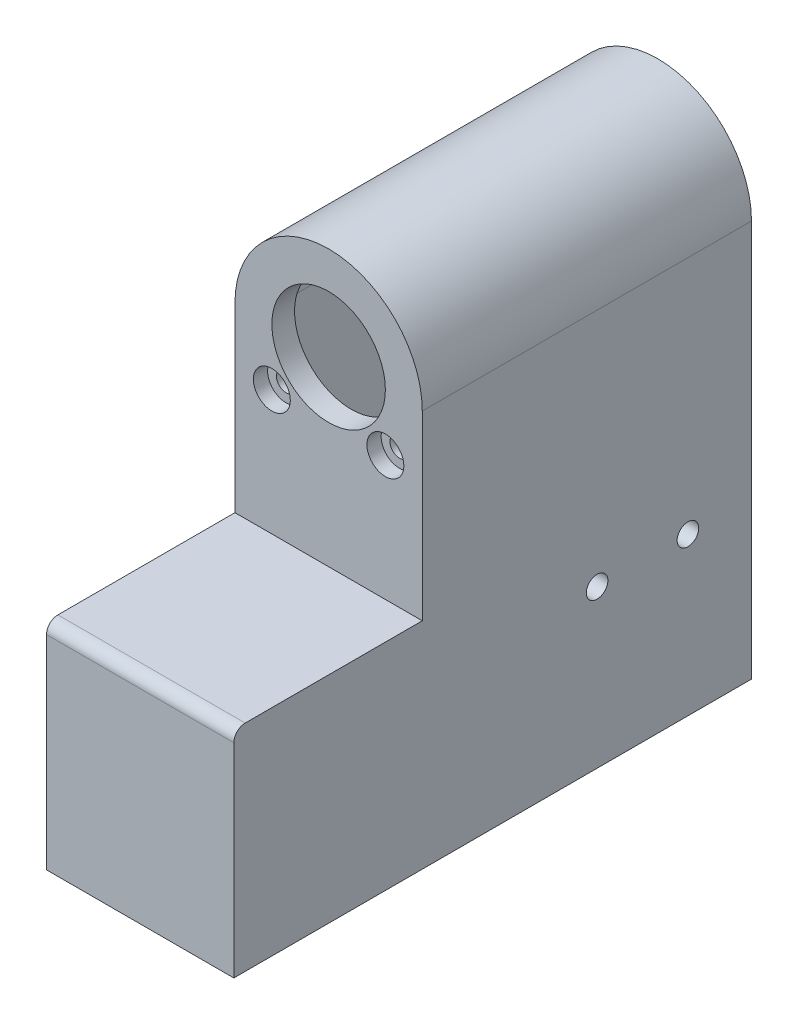
ISO-10303-21;
HEADER;
FILE_DESCRIPTION(('STEP AP214'),'2;1');
FILE_NAME('part.step','',(''),(''),'','','');
FILE_SCHEMA(('AUTOMOTIVE_DESIGN { 1 0 10303 214 1 1 1 1 }'));
ENDSEC;
DATA;
#1=APPLICATION_CONTEXT('core data for automotive mechanical design processes');
#2=APPLICATION_PROTOCOL_DEFINITION('international standard','automotive_design',2000,#1);
#3=PRODUCT_CONTEXT('',#1,'mechanical');
#4=PRODUCT('Part','Part','',(#3));
#5=PRODUCT_RELATED_PRODUCT_CATEGORY('part','',(#4));
#6=PRODUCT_DEFINITION_FORMATION('','',#4);
#7=PRODUCT_DEFINITION_CONTEXT('part definition',#1,'design');
#8=PRODUCT_DEFINITION('design','',#6,#7);
#9=PRODUCT_DEFINITION_SHAPE('','',#8);
#10=(LENGTH_UNIT() NAMED_UNIT(*) SI_UNIT(.MILLI.,.METRE.));
#11=(NAMED_UNIT(*) PLANE_ANGLE_UNIT() SI_UNIT($,.RADIAN.));
#12=(NAMED_UNIT(*) SI_UNIT($,.STERADIAN.) SOLID_ANGLE_UNIT());
#13=UNCERTAINTY_MEASURE_WITH_UNIT(LENGTH_MEASURE(1.E-05),#10,'distance_accuracy_value','');
#14=(GEOMETRIC_REPRESENTATION_CONTEXT(3) GLOBAL_UNCERTAINTY_ASSIGNED_CONTEXT((#13)) GLOBAL_UNIT_ASSIGNED_CONTEXT((#10,
#11,#12)) REPRESENTATION_CONTEXT('',''));
#15=CARTESIAN_POINT('',(0.,0.,0.));
#16=DIRECTION('',(0.,0.,1.));
#17=DIRECTION('',(1.,0.,0.));
#18=AXIS2_PLACEMENT_3D('',#15,#16,#17);
#19=CARTESIAN_POINT('',(33.,0.,71.));
#20=DIRECTION('',(-1.,0.,0.));
#21=DIRECTION('',(0.,0.,1.));
#22=AXIS2_PLACEMENT_3D('',#19,#20,#21);
#23=PLANE('',#22);
#24=CARTESIAN_POINT('',(33.,38.3,40.2));
#25=DIRECTION('',(-1.,0.,0.));
#26=DIRECTION('',(0.,0.,1.));
#27=AXIS2_PLACEMENT_3D('',#24,#25,#26);
#28=CIRCLE('',#27,1.9);
#29=CARTESIAN_POINT('',(33.,38.3,42.1));
#30=VERTEX_POINT('',#29);
#31=EDGE_CURVE('E256',#30,#30,#28,.F.);
#32=ORIENTED_EDGE('',*,*,#31,.F.);
#33=EDGE_LOOP('',(#32));
#34=FACE_BOUND('',#33,.T.);
#35=CARTESIAN_POINT('',(33.,38.3,24.2));
#36=DIRECTION('',(-1.,0.,0.));
#37=DIRECTION('',(0.,0.,1.));
#38=AXIS2_PLACEMENT_3D('',#35,#36,#37);
#39=CIRCLE('',#38,1.9);
#40=CARTESIAN_POINT('',(33.,38.3,26.1));
#41=VERTEX_POINT('',#40);
#42=EDGE_CURVE('E260',#41,#41,#39,.F.);
#43=ORIENTED_EDGE('',*,*,#42,.F.);
#44=EDGE_LOOP('',(#43));
#45=FACE_BOUND('',#44,.T.);
#46=DIRECTION('',(0.,0.,-1.));
#47=VECTOR('',#46,1.);
#48=CARTESIAN_POINT('',(33.,48.5,101.2));
#49=LINE('',#48,#47);
#50=CARTESIAN_POINT('',(33.,48.5,102.2));
#51=VERTEX_POINT('',#50);
#52=CARTESIAN_POINT('',(33.,48.5,71.));
#53=VERTEX_POINT('',#52);
#54=EDGE_CURVE('E192',#51,#53,#49,.T.);
#55=ORIENTED_EDGE('',*,*,#54,.F.);
#56=CARTESIAN_POINT('',(33.,46.5,102.2));
#57=DIRECTION('',(-1.,0.,0.));
#58=DIRECTION('',(0.,0.,1.));
#59=AXIS2_PLACEMENT_3D('',#56,#57,#58);
#60=CIRCLE('',#59,2.);
#61=CARTESIAN_POINT('',(33.,46.5,104.2));
#62=VERTEX_POINT('',#61);
#63=EDGE_CURVE('E11',#51,#62,#60,.F.);
#64=ORIENTED_EDGE('',*,*,#63,.T.);
#65=DIRECTION('',(0.,1.,0.));
#66=VECTOR('',#65,1.);
#67=CARTESIAN_POINT('',(33.,10.6,104.2));
#68=LINE('',#67,#66);
#69=CARTESIAN_POINT('',(33.,10.6,104.2));
#70=VERTEX_POINT('',#69);
#71=EDGE_CURVE('E132',#70,#62,#68,.T.);
#72=ORIENTED_EDGE('',*,*,#71,.F.);
#73=DIRECTION('',(0.,0.,1.));
#74=VECTOR('',#73,1.);
#75=CARTESIAN_POINT('',(33.,10.6,13.));
#76=LINE('',#75,#74);
#77=CARTESIAN_POINT('',(33.,10.6,13.));
#78=VERTEX_POINT('',#77);
#79=EDGE_CURVE('E142',#78,#70,#76,.T.);
#80=ORIENTED_EDGE('',*,*,#79,.F.);
#81=DIRECTION('',(0.,-1.,0.));
#82=VECTOR('',#81,1.);
#83=CARTESIAN_POINT('',(33.,80.5,13.));
#84=LINE('',#83,#82);
#85=CARTESIAN_POINT('',(33.,80.5,13.));
#86=VERTEX_POINT('',#85);
#87=EDGE_CURVE('E184',#86,#78,#84,.T.);
#88=ORIENTED_EDGE('',*,*,#87,.F.);
#89=DIRECTION('',(0.,0.,-1.));
#90=VECTOR('',#89,1.);
#91=CARTESIAN_POINT('',(33.,80.5,71.));
#92=LINE('',#91,#90);
#93=CARTESIAN_POINT('',(33.,80.5,71.));
#94=VERTEX_POINT('',#93);
#95=EDGE_CURVE('E220',#94,#86,#92,.T.);
#96=ORIENTED_EDGE('',*,*,#95,.F.);
#97=DIRECTION('',(0.,1.,0.));
#98=VECTOR('',#97,1.);
#99=CARTESIAN_POINT('',(33.,0.,71.));
#100=LINE('',#99,#98);
#101=EDGE_CURVE('E210',#53,#94,#100,.T.);
#102=ORIENTED_EDGE('',*,*,#101,.F.);
#103=EDGE_LOOP('',(#55,#64,#72,#80,#88,#96,#102));
#104=FACE_BOUND('',#103,.T.);
#105=ADVANCED_FACE('F35',(#34,#45,#104),#23,.F.);
#106=CARTESIAN_POINT('',(0.,0.,71.));
#107=DIRECTION('',(-1.,0.,0.));
#108=DIRECTION('',(0.,0.,1.));
#109=AXIS2_PLACEMENT_3D('',#106,#107,#108);
#110=PLANE('',#109);
#111=CARTESIAN_POINT('',(0.,38.3,24.2));
#112=DIRECTION('',(-1.,0.,0.));
#113=DIRECTION('',(0.,0.,1.));
#114=AXIS2_PLACEMENT_3D('',#111,#112,#113);
#115=CIRCLE('',#114,1.9);
#116=CARTESIAN_POINT('',(0.,38.3,26.1));
#117=VERTEX_POINT('',#116);
#118=EDGE_CURVE('E257',#117,#117,#115,.T.);
#119=ORIENTED_EDGE('',*,*,#118,.F.);
#120=EDGE_LOOP('',(#119));
#121=FACE_BOUND('',#120,.T.);
#122=CARTESIAN_POINT('',(0.,38.3,40.2));
#123=DIRECTION('',(-1.,0.,0.));
#124=DIRECTION('',(0.,0.,1.));
#125=AXIS2_PLACEMENT_3D('',#122,#123,#124);
#126=CIRCLE('',#125,1.9);
#127=CARTESIAN_POINT('',(0.,38.3,42.1));
#128=VERTEX_POINT('',#127);
#129=EDGE_CURVE('E261',#128,#128,#126,.T.);
#130=ORIENTED_EDGE('',*,*,#129,.F.);
#131=EDGE_LOOP('',(#130));
#132=FACE_BOUND('',#131,.T.);
#133=DIRECTION('',(0.,-1.,0.));
#134=VECTOR('',#133,1.);
#135=CARTESIAN_POINT('',(0.,48.5,104.2));
#136=LINE('',#135,#134);
#137=CARTESIAN_POINT('',(0.,46.5,104.2));
#138=VERTEX_POINT('',#137);
#139=CARTESIAN_POINT('',(0.,10.6,104.2));
#140=VERTEX_POINT('',#139);
#141=EDGE_CURVE('E134',#138,#140,#136,.T.);
#142=ORIENTED_EDGE('',*,*,#141,.F.);
#143=CARTESIAN_POINT('',(0.,46.5,102.2));
#144=DIRECTION('',(-1.,0.,0.));
#145=DIRECTION('',(0.,0.,1.));
#146=AXIS2_PLACEMENT_3D('',#143,#144,#145);
#147=CIRCLE('',#146,2.);
#148=CARTESIAN_POINT('',(0.,48.5,102.2));
#149=VERTEX_POINT('',#148);
#150=EDGE_CURVE('E57',#138,#149,#147,.T.);
#151=ORIENTED_EDGE('',*,*,#150,.T.);
#152=DIRECTION('',(0.,0.,-1.));
#153=VECTOR('',#152,1.);
#154=CARTESIAN_POINT('',(0.,48.5,101.2));
#155=LINE('',#154,#153);
#156=CARTESIAN_POINT('',(0.,48.5,71.));
#157=VERTEX_POINT('',#156);
#158=EDGE_CURVE('E195',#149,#157,#155,.T.);
#159=ORIENTED_EDGE('',*,*,#158,.T.);
#160=DIRECTION('',(0.,1.,0.));
#161=VECTOR('',#160,1.);
#162=CARTESIAN_POINT('',(0.,0.,71.));
#163=LINE('',#162,#161);
#164=CARTESIAN_POINT('',(0.,80.5,71.));
#165=VERTEX_POINT('',#164);
#166=EDGE_CURVE('E215',#157,#165,#163,.T.);
#167=ORIENTED_EDGE('',*,*,#166,.T.);
#168=DIRECTION('',(0.,0.,-1.));
#169=VECTOR('',#168,1.);
#170=CARTESIAN_POINT('',(0.,80.5,71.));
#171=LINE('',#170,#169);
#172=CARTESIAN_POINT('',(0.,80.5,13.));
#173=VERTEX_POINT('',#172);
#174=EDGE_CURVE('E217',#165,#173,#171,.T.);
#175=ORIENTED_EDGE('',*,*,#174,.T.);
#176=DIRECTION('',(0.,1.,0.));
#177=VECTOR('',#176,1.);
#178=CARTESIAN_POINT('',(0.,0.,13.));
#179=LINE('',#178,#177);
#180=CARTESIAN_POINT('',(0.,10.6,13.));
#181=VERTEX_POINT('',#180);
#182=EDGE_CURVE('E180',#181,#173,#179,.T.);
#183=ORIENTED_EDGE('',*,*,#182,.F.);
#184=DIRECTION('',(0.,0.,-1.));
#185=VECTOR('',#184,1.);
#186=CARTESIAN_POINT('',(0.,10.6,105.2));
#187=LINE('',#186,#185);
#188=EDGE_CURVE('E150',#140,#181,#187,.T.);
#189=ORIENTED_EDGE('',*,*,#188,.F.);
#190=EDGE_LOOP('',(#142,#151,#159,#167,#175,#183,#189));
#191=FACE_BOUND('',#190,.T.);
#192=ADVANCED_FACE('F244',(#121,#132,#191),#110,.T.);
#193=CARTESIAN_POINT('',(0.,48.5,101.2));
#194=DIRECTION('',(0.,-1.,0.));
#195=DIRECTION('',(0.,0.,-1.));
#196=AXIS2_PLACEMENT_3D('',#193,#194,#195);
#197=PLANE('',#196);
#198=ORIENTED_EDGE('',*,*,#158,.F.);
#199=DIRECTION('',(-1.,0.,0.));
#200=VECTOR('',#199,1.);
#201=CARTESIAN_POINT('',(33.,48.5,102.2));
#202=LINE('',#201,#200);
#203=EDGE_CURVE('E43',#149,#51,#202,.F.);
#204=ORIENTED_EDGE('',*,*,#203,.T.);
#205=ORIENTED_EDGE('',*,*,#54,.T.);
#206=DIRECTION('',(1.,0.,0.));
#207=VECTOR('',#206,1.);
#208=CARTESIAN_POINT('',(33.,48.5,71.));
#209=LINE('',#208,#207);
#210=EDGE_CURVE('E194',#157,#53,#209,.T.);
#211=ORIENTED_EDGE('',*,*,#210,.F.);
#212=EDGE_LOOP('',(#198,#204,#205,#211));
#213=FACE_BOUND('',#212,.T.);
#214=ADVANCED_FACE('F322',(#213),#197,.F.);
#215=CARTESIAN_POINT('',(0.,10.6,0.));
#216=DIRECTION('',(0.,-1.,0.));
#217=DIRECTION('',(0.,0.,-1.));
#218=AXIS2_PLACEMENT_3D('',#215,#216,#217);
#219=PLANE('',#218);
#220=ORIENTED_EDGE('',*,*,#79,.T.);
#221=DIRECTION('',(1.,0.,0.));
#222=VECTOR('',#221,1.);
#223=CARTESIAN_POINT('',(0.,10.6,104.2));
#224=LINE('',#223,#222);
#225=EDGE_CURVE('E128',#140,#70,#224,.T.);
#226=ORIENTED_EDGE('',*,*,#225,.F.);
#227=ORIENTED_EDGE('',*,*,#188,.T.);
#228=DIRECTION('',(1.,0.,0.));
#229=VECTOR('',#228,1.);
#230=CARTESIAN_POINT('',(0.,10.6,13.));
#231=LINE('',#230,#229);
#232=CARTESIAN_POINT('',(4.,10.6,13.));
#233=VERTEX_POINT('',#232);
#234=EDGE_CURVE('E280',#181,#233,#231,.T.);
#235=ORIENTED_EDGE('',*,*,#234,.T.);
#236=DIRECTION('',(0.,0.,1.));
#237=VECTOR('',#236,1.);
#238=CARTESIAN_POINT('',(4.,10.6,13.));
#239=LINE('',#238,#237);
#240=CARTESIAN_POINT('',(4.,10.6,100.2));
#241=VERTEX_POINT('',#240);
#242=EDGE_CURVE('E282',#233,#241,#239,.T.);
#243=ORIENTED_EDGE('',*,*,#242,.T.);
#244=DIRECTION('',(-1.,0.,0.));
#245=VECTOR('',#244,1.);
#246=CARTESIAN_POINT('',(29.,10.6,100.2));
#247=LINE('',#246,#245);
#248=CARTESIAN_POINT('',(29.,10.6,100.2));
#249=VERTEX_POINT('',#248);
#250=EDGE_CURVE('E250',#249,#241,#247,.T.);
#251=ORIENTED_EDGE('',*,*,#250,.F.);
#252=DIRECTION('',(0.,0.,-1.));
#253=VECTOR('',#252,1.);
#254=CARTESIAN_POINT('',(29.,10.6,101.2));
#255=LINE('',#254,#253);
#256=CARTESIAN_POINT('',(29.,10.6,13.));
#257=VERTEX_POINT('',#256);
#258=EDGE_CURVE('E154',#249,#257,#255,.T.);
#259=ORIENTED_EDGE('',*,*,#258,.T.);
#260=DIRECTION('',(1.,0.,0.));
#261=VECTOR('',#260,1.);
#262=CARTESIAN_POINT('',(29.,10.6,13.));
#263=LINE('',#262,#261);
#264=EDGE_CURVE('E149',#257,#78,#263,.T.);
#265=ORIENTED_EDGE('',*,*,#264,.T.);
#266=EDGE_LOOP('',(#220,#226,#227,#235,#243,#251,#259,#265));
#267=FACE_BOUND('',#266,.T.);
#268=ADVANCED_FACE('F147',(#267),#219,.T.);
#269=CARTESIAN_POINT('',(29.,0.,71.));
#270=DIRECTION('',(-1.,0.,0.));
#271=DIRECTION('',(0.,0.,1.));
#272=AXIS2_PLACEMENT_3D('',#269,#270,#271);
#273=PLANE('',#272);
#274=DIRECTION('',(0.,-1.,0.));
#275=VECTOR('',#274,1.);
#276=CARTESIAN_POINT('',(29.,44.5,100.2));
#277=LINE('',#276,#275);
#278=CARTESIAN_POINT('',(29.,44.5,100.2));
#279=VERTEX_POINT('',#278);
#280=EDGE_CURVE('E145',#279,#249,#277,.T.);
#281=ORIENTED_EDGE('',*,*,#280,.F.);
#282=DIRECTION('',(0.,0.,-1.));
#283=VECTOR('',#282,1.);
#284=CARTESIAN_POINT('',(29.,44.5,101.2));
#285=LINE('',#284,#283);
#286=CARTESIAN_POINT('',(29.,44.5,67.));
#287=VERTEX_POINT('',#286);
#288=EDGE_CURVE('E191',#279,#287,#285,.T.);
#289=ORIENTED_EDGE('',*,*,#288,.T.);
#290=DIRECTION('',(0.,1.,0.));
#291=VECTOR('',#290,1.);
#292=CARTESIAN_POINT('',(29.,0.,67.));
#293=LINE('',#292,#291);
#294=CARTESIAN_POINT('',(29.,80.5,67.));
#295=VERTEX_POINT('',#294);
#296=EDGE_CURVE('E202',#287,#295,#293,.T.);
#297=ORIENTED_EDGE('',*,*,#296,.T.);
#298=DIRECTION('',(0.,0.,-1.));
#299=VECTOR('',#298,1.);
#300=CARTESIAN_POINT('',(29.,80.5,71.));
#301=LINE('',#300,#299);
#302=CARTESIAN_POINT('',(29.,80.5,13.));
#303=VERTEX_POINT('',#302);
#304=EDGE_CURVE('E223',#295,#303,#301,.T.);
#305=ORIENTED_EDGE('',*,*,#304,.T.);
#306=DIRECTION('',(0.,1.,0.));
#307=VECTOR('',#306,1.);
#308=CARTESIAN_POINT('',(29.,0.,13.));
#309=LINE('',#308,#307);
#310=EDGE_CURVE('E186',#257,#303,#309,.T.);
#311=ORIENTED_EDGE('',*,*,#310,.F.);
#312=ORIENTED_EDGE('',*,*,#258,.F.);
#313=EDGE_LOOP('',(#281,#289,#297,#305,#311,#312));
#314=FACE_BOUND('',#313,.T.);
#315=CARTESIAN_POINT('',(29.,38.3,24.2));
#316=DIRECTION('',(-1.,0.,0.));
#317=DIRECTION('',(0.,0.,1.));
#318=AXIS2_PLACEMENT_3D('',#315,#316,#317);
#319=CIRCLE('',#318,1.9);
#320=CARTESIAN_POINT('',(29.,38.3,26.1));
#321=VERTEX_POINT('',#320);
#322=EDGE_CURVE('E277',#321,#321,#319,.T.);
#323=ORIENTED_EDGE('',*,*,#322,.F.);
#324=EDGE_LOOP('',(#323));
#325=FACE_BOUND('',#324,.T.);
#326=CARTESIAN_POINT('',(29.,38.3,40.2));
#327=DIRECTION('',(-1.,0.,0.));
#328=DIRECTION('',(0.,0.,1.));
#329=AXIS2_PLACEMENT_3D('',#326,#327,#328);
#330=CIRCLE('',#329,1.9);
#331=CARTESIAN_POINT('',(29.,38.3,42.1));
#332=VERTEX_POINT('',#331);
#333=EDGE_CURVE('E271',#332,#332,#330,.T.);
#334=ORIENTED_EDGE('',*,*,#333,.F.);
#335=EDGE_LOOP('',(#334));
#336=FACE_BOUND('',#335,.T.);
#337=ADVANCED_FACE('F291',(#314,#325,#336),#273,.T.);
#338=CARTESIAN_POINT('',(4.,0.,71.));
#339=DIRECTION('',(-1.,0.,0.));
#340=DIRECTION('',(0.,0.,1.));
#341=AXIS2_PLACEMENT_3D('',#338,#339,#340);
#342=PLANE('',#341);
#343=CARTESIAN_POINT('',(4.,38.3,24.2));
#344=DIRECTION('',(-1.,0.,0.));
#345=DIRECTION('',(0.,0.,1.));
#346=AXIS2_PLACEMENT_3D('',#343,#344,#345);
#347=CIRCLE('',#346,1.9);
#348=CARTESIAN_POINT('',(4.,38.3,26.1));
#349=VERTEX_POINT('',#348);
#350=EDGE_CURVE('E274',#349,#349,#347,.T.);
#351=ORIENTED_EDGE('',*,*,#350,.T.);
#352=EDGE_LOOP('',(#351));
#353=FACE_BOUND('',#352,.T.);
#354=CARTESIAN_POINT('',(4.,38.3,40.2));
#355=DIRECTION('',(-1.,0.,0.));
#356=DIRECTION('',(0.,0.,1.));
#357=AXIS2_PLACEMENT_3D('',#354,#355,#356);
#358=CIRCLE('',#357,1.9);
#359=CARTESIAN_POINT('',(4.,38.3,42.1));
#360=VERTEX_POINT('',#359);
#361=EDGE_CURVE('E264',#360,#360,#358,.T.);
#362=ORIENTED_EDGE('',*,*,#361,.T.);
#363=EDGE_LOOP('',(#362));
#364=FACE_BOUND('',#363,.T.);
#365=DIRECTION('',(0.,0.,-1.));
#366=VECTOR('',#365,1.);
#367=CARTESIAN_POINT('',(4.,44.5,101.2));
#368=LINE('',#367,#366);
#369=CARTESIAN_POINT('',(4.,44.5,100.2));
#370=VERTEX_POINT('',#369);
#371=CARTESIAN_POINT('',(4.,44.5,67.));
#372=VERTEX_POINT('',#371);
#373=EDGE_CURVE('E197',#370,#372,#368,.T.);
#374=ORIENTED_EDGE('',*,*,#373,.F.);
#375=DIRECTION('',(0.,1.,0.));
#376=VECTOR('',#375,1.);
#377=CARTESIAN_POINT('',(4.,10.6,100.2));
#378=LINE('',#377,#376);
#379=EDGE_CURVE('E252',#241,#370,#378,.T.);
#380=ORIENTED_EDGE('',*,*,#379,.F.);
#381=ORIENTED_EDGE('',*,*,#242,.F.);
#382=DIRECTION('',(0.,-1.,0.));
#383=VECTOR('',#382,1.);
#384=CARTESIAN_POINT('',(4.,80.5,13.));
#385=LINE('',#384,#383);
#386=CARTESIAN_POINT('',(4.,80.5,13.));
#387=VERTEX_POINT('',#386);
#388=EDGE_CURVE('E177',#387,#233,#385,.T.);
#389=ORIENTED_EDGE('',*,*,#388,.F.);
#390=DIRECTION('',(0.,0.,-1.));
#391=VECTOR('',#390,1.);
#392=CARTESIAN_POINT('',(4.,80.5,71.));
#393=LINE('',#392,#391);
#394=CARTESIAN_POINT('',(4.,80.5,67.));
#395=VERTEX_POINT('',#394);
#396=EDGE_CURVE('E226',#395,#387,#393,.T.);
#397=ORIENTED_EDGE('',*,*,#396,.F.);
#398=DIRECTION('',(0.,1.,0.));
#399=VECTOR('',#398,1.);
#400=CARTESIAN_POINT('',(4.,0.,67.));
#401=LINE('',#400,#399);
#402=EDGE_CURVE('E207',#372,#395,#401,.T.);
#403=ORIENTED_EDGE('',*,*,#402,.F.);
#404=EDGE_LOOP('',(#374,#380,#381,#389,#397,#403));
#405=FACE_BOUND('',#404,.T.);
#406=ADVANCED_FACE('F305',(#353,#364,#405),#342,.F.);
#407=CARTESIAN_POINT('',(16.5,80.5,13.));
#408=DIRECTION('',(0.,0.,-1.));
#409=DIRECTION('',(-1.,0.,0.));
#410=AXIS2_PLACEMENT_3D('',#407,#408,#409);
#411=PLANE('',#410);
#412=ORIENTED_EDGE('',*,*,#87,.T.);
#413=ORIENTED_EDGE('',*,*,#264,.F.);
#414=ORIENTED_EDGE('',*,*,#310,.T.);
#415=CARTESIAN_POINT('',(16.5,80.5,13.));
#416=DIRECTION('',(0.,0.,1.));
#417=DIRECTION('',(-1.,0.,0.));
#418=AXIS2_PLACEMENT_3D('',#415,#416,#417);
#419=CIRCLE('',#418,12.5);
#420=EDGE_CURVE('E175',#303,#387,#419,.T.);
#421=ORIENTED_EDGE('',*,*,#420,.T.);
#422=ORIENTED_EDGE('',*,*,#388,.T.);
#423=ORIENTED_EDGE('',*,*,#234,.F.);
#424=ORIENTED_EDGE('',*,*,#182,.T.);
#425=CARTESIAN_POINT('',(16.5,80.5,13.));
#426=DIRECTION('',(0.,0.,-1.));
#427=DIRECTION('',(-1.,0.,0.));
#428=AXIS2_PLACEMENT_3D('',#425,#426,#427);
#429=CIRCLE('',#428,16.5);
#430=EDGE_CURVE('E182',#173,#86,#429,.T.);
#431=ORIENTED_EDGE('',*,*,#430,.T.);
#432=EDGE_LOOP('',(#412,#413,#414,#421,#422,#423,#424,#431));
#433=FACE_BOUND('',#432,.T.);
#434=ADVANCED_FACE('F289',(#433),#411,.T.);
#435=CARTESIAN_POINT('',(26.5,70.5,58.));
#436=DIRECTION('',(0.,0.,1.));
#437=DIRECTION('',(1.,0.,0.));
#438=AXIS2_PLACEMENT_3D('',#435,#436,#437);
#439=CYLINDRICAL_SURFACE('',#438,1.7);
#440=CARTESIAN_POINT('',(26.5,70.5,67.));
#441=DIRECTION('',(0.,0.,1.));
#442=DIRECTION('',(1.,0.,0.));
#443=AXIS2_PLACEMENT_3D('',#440,#441,#442);
#444=CIRCLE('',#443,1.7);
#445=CARTESIAN_POINT('',(28.2,70.5,67.));
#446=VERTEX_POINT('',#445);
#447=EDGE_CURVE('E232',#446,#446,#444,.T.);
#448=CARTESIAN_POINT('',(26.5,70.5,68.5));
#449=DIRECTION('',(0.,0.,1.));
#450=DIRECTION('',(1.,0.,0.));
#451=AXIS2_PLACEMENT_3D('',#448,#449,#450);
#452=CIRCLE('',#451,1.7);
#453=CARTESIAN_POINT('',(28.2,70.5,68.5));
#454=VERTEX_POINT('',#453);
#455=EDGE_CURVE('E235',#454,#454,#452,.F.);
#456=CARTESIAN_POINT('',(28.2,70.5,67.));
#457=CARTESIAN_POINT('',(28.2,70.5,67.015625));
#458=CARTESIAN_POINT('',(28.2,70.5,67.03125));
#459=CARTESIAN_POINT('',(28.2,70.5,67.0625));
#460=CARTESIAN_POINT('',(28.2,70.5,67.078125));
#461=CARTESIAN_POINT('',(28.2,70.5,67.109375));
#462=CARTESIAN_POINT('',(28.2,70.5,67.125));
#463=CARTESIAN_POINT('',(28.2,70.5,67.15625));
#464=CARTESIAN_POINT('',(28.2,70.5,67.171875));
#465=CARTESIAN_POINT('',(28.2,70.5,67.203125));
#466=CARTESIAN_POINT('',(28.2,70.5,67.21875));
#467=CARTESIAN_POINT('',(28.2,70.5,67.25));
#468=CARTESIAN_POINT('',(28.2,70.5,67.265625));
#469=CARTESIAN_POINT('',(28.2,70.5,67.296875));
#470=CARTESIAN_POINT('',(28.2,70.5,67.3125));
#471=CARTESIAN_POINT('',(28.2,70.5,67.34375));
#472=CARTESIAN_POINT('',(28.2,70.5,67.359375));
#473=CARTESIAN_POINT('',(28.2,70.5,67.390625));
#474=CARTESIAN_POINT('',(28.2,70.5,67.40625));
#475=CARTESIAN_POINT('',(28.2,70.5,67.4375));
#476=CARTESIAN_POINT('',(28.2,70.5,67.453125));
#477=CARTESIAN_POINT('',(28.2,70.5,67.484375));
#478=CARTESIAN_POINT('',(28.2,70.5,67.5));
#479=CARTESIAN_POINT('',(28.2,70.5,67.53125));
#480=CARTESIAN_POINT('',(28.2,70.5,67.546875));
#481=CARTESIAN_POINT('',(28.2,70.5,67.578125));
#482=CARTESIAN_POINT('',(28.2,70.5,67.59375));
#483=CARTESIAN_POINT('',(28.2,70.5,67.625));
#484=CARTESIAN_POINT('',(28.2,70.5,67.640625));
#485=CARTESIAN_POINT('',(28.2,70.5,67.671875));
#486=CARTESIAN_POINT('',(28.2,70.5,67.6875));
#487=CARTESIAN_POINT('',(28.2,70.5,67.71875));
#488=CARTESIAN_POINT('',(28.2,70.5,67.734375));
#489=CARTESIAN_POINT('',(28.2,70.5,67.765625));
#490=CARTESIAN_POINT('',(28.2,70.5,67.78125));
#491=CARTESIAN_POINT('',(28.2,70.5,67.8125));
#492=CARTESIAN_POINT('',(28.2,70.5,67.828125));
#493=CARTESIAN_POINT('',(28.2,70.5,67.859375));
#494=CARTESIAN_POINT('',(28.2,70.5,67.875));
#495=CARTESIAN_POINT('',(28.2,70.5,67.90625));
#496=CARTESIAN_POINT('',(28.2,70.5,67.921875));
#497=CARTESIAN_POINT('',(28.2,70.5,67.953125));
#498=CARTESIAN_POINT('',(28.2,70.5,67.96875));
#499=CARTESIAN_POINT('',(28.2,70.5,68.));
#500=CARTESIAN_POINT('',(28.2,70.5,68.015625));
#501=CARTESIAN_POINT('',(28.2,70.5,68.046875));
#502=CARTESIAN_POINT('',(28.2,70.5,68.0625));
#503=CARTESIAN_POINT('',(28.2,70.5,68.09375));
#504=CARTESIAN_POINT('',(28.2,70.5,68.109375));
#505=CARTESIAN_POINT('',(28.2,70.5,68.140625));
#506=CARTESIAN_POINT('',(28.2,70.5,68.15625));
#507=CARTESIAN_POINT('',(28.2,70.5,68.1875));
#508=CARTESIAN_POINT('',(28.2,70.5,68.203125));
#509=CARTESIAN_POINT('',(28.2,70.5,68.234375));
#510=CARTESIAN_POINT('',(28.2,70.5,68.25));
#511=CARTESIAN_POINT('',(28.2,70.5,68.28125));
#512=CARTESIAN_POINT('',(28.2,70.5,68.296875));
#513=CARTESIAN_POINT('',(28.2,70.5,68.328125));
#514=CARTESIAN_POINT('',(28.2,70.5,68.34375));
#515=CARTESIAN_POINT('',(28.2,70.5,68.375));
#516=CARTESIAN_POINT('',(28.2,70.5,68.390625));
#517=CARTESIAN_POINT('',(28.2,70.5,68.421875));
#518=CARTESIAN_POINT('',(28.2,70.5,68.4375));
#519=CARTESIAN_POINT('',(28.2,70.5,68.46875));
#520=CARTESIAN_POINT('',(28.2,70.5,68.484375));
#521=CARTESIAN_POINT('',(28.2,70.5,68.5));
#522=B_SPLINE_CURVE_WITH_KNOTS('',3,(#456,#457,#458,#459,#460,#461,#462,#463,#464,#465,#466,
#467,#468,#469,#470,#471,#472,#473,#474,#475,#476,#477,#478,#479,#480,#481,#482,#483,#484,#485,
#486,#487,#488,#489,#490,#491,#492,#493,#494,#495,#496,#497,#498,#499,#500,#501,#502,#503,#504,
#505,#506,#507,#508,#509,#510,#511,#512,#513,#514,#515,#516,#517,#518,#519,#520,#521),
.UNSPECIFIED.,.F.,.F.,(4,2,2,2,2,2,2,2,2,2,2,2,2,2,2,2,2,2,2,2,2,2,2,2,2,2,2,2,2,2,2,2,4),(0.,
0.0468749999999879,0.0937499999999897,0.140624999999991,0.187499999999993,0.234374999999995,
0.281249999999997,0.328124999999999,0.375,0.421875000000002,0.46874999999999,0.515624999999992,
0.562499999999994,0.609374999999995,0.656249999999997,0.703124999999999,0.750000000000001,
0.796874999999989,0.84374999999999,0.890624999999992,0.937499999999994,0.984374999999996,
1.03125,1.078125,1.125,1.171875,1.21874999999999,1.26562499999999,1.31249999999999,1.359375,
1.40625,1.453125,1.5),.UNSPECIFIED.);
#523=EDGE_CURVE('BSEAM349',#446,#454,#522,.T.);
#524=ORIENTED_EDGE('',*,*,#447,.F.);
#525=ORIENTED_EDGE('',*,*,#455,.F.);
#526=ORIENTED_EDGE('',*,*,#523,.T.);
#527=ORIENTED_EDGE('',*,*,#523,.F.);
#528=EDGE_LOOP('',(#524,#526,#525,#527));
#529=FACE_BOUND('',#528,.T.);
#530=ADVANCED_FACE('F349',(#529),#439,.F.);
#531=CARTESIAN_POINT('',(6.5,70.5,58.));
#532=DIRECTION('',(0.,0.,1.));
#533=DIRECTION('',(1.,0.,0.));
#534=AXIS2_PLACEMENT_3D('',#531,#532,#533);
#535=CYLINDRICAL_SURFACE('',#534,1.7);
#536=CARTESIAN_POINT('',(6.5,70.5,67.));
#537=DIRECTION('',(0.,0.,1.));
#538=DIRECTION('',(1.,0.,0.));
#539=AXIS2_PLACEMENT_3D('',#536,#537,#538);
#540=CIRCLE('',#539,1.7);
#541=CARTESIAN_POINT('',(8.2,70.5,67.));
#542=VERTEX_POINT('',#541);
#543=EDGE_CURVE('E174',#542,#542,#540,.F.);
#544=CARTESIAN_POINT('',(6.5,70.5,68.5));
#545=DIRECTION('',(0.,0.,1.));
#546=DIRECTION('',(1.,0.,0.));
#547=AXIS2_PLACEMENT_3D('',#544,#545,#546);
#548=CIRCLE('',#547,1.7);
#549=CARTESIAN_POINT('',(8.2,70.5,68.5));
#550=VERTEX_POINT('',#549);
#551=EDGE_CURVE('E161',#550,#550,#548,.T.);
#552=CARTESIAN_POINT('',(8.2,70.5,67.));
#553=CARTESIAN_POINT('',(8.2,70.5,67.015625));
#554=CARTESIAN_POINT('',(8.2,70.5,67.03125));
#555=CARTESIAN_POINT('',(8.2,70.5,67.0625));
#556=CARTESIAN_POINT('',(8.2,70.5,67.078125));
#557=CARTESIAN_POINT('',(8.2,70.5,67.109375));
#558=CARTESIAN_POINT('',(8.2,70.5,67.125));
#559=CARTESIAN_POINT('',(8.2,70.5,67.15625));
#560=CARTESIAN_POINT('',(8.2,70.5,67.171875));
#561=CARTESIAN_POINT('',(8.2,70.5,67.203125));
#562=CARTESIAN_POINT('',(8.2,70.5,67.21875));
#563=CARTESIAN_POINT('',(8.2,70.5,67.25));
#564=CARTESIAN_POINT('',(8.2,70.5,67.265625));
#565=CARTESIAN_POINT('',(8.2,70.5,67.296875));
#566=CARTESIAN_POINT('',(8.2,70.5,67.3125));
#567=CARTESIAN_POINT('',(8.2,70.5,67.34375));
#568=CARTESIAN_POINT('',(8.2,70.5,67.359375));
#569=CARTESIAN_POINT('',(8.2,70.5,67.390625));
#570=CARTESIAN_POINT('',(8.2,70.5,67.40625));
#571=CARTESIAN_POINT('',(8.2,70.5,67.4375));
#572=CARTESIAN_POINT('',(8.2,70.5,67.453125));
#573=CARTESIAN_POINT('',(8.2,70.5,67.484375));
#574=CARTESIAN_POINT('',(8.2,70.5,67.5));
#575=CARTESIAN_POINT('',(8.2,70.5,67.53125));
#576=CARTESIAN_POINT('',(8.2,70.5,67.546875));
#577=CARTESIAN_POINT('',(8.2,70.5,67.578125));
#578=CARTESIAN_POINT('',(8.2,70.5,67.59375));
#579=CARTESIAN_POINT('',(8.2,70.5,67.625));
#580=CARTESIAN_POINT('',(8.2,70.5,67.640625));
#581=CARTESIAN_POINT('',(8.2,70.5,67.671875));
#582=CARTESIAN_POINT('',(8.2,70.5,67.6875));
#583=CARTESIAN_POINT('',(8.2,70.5,67.71875));
#584=CARTESIAN_POINT('',(8.2,70.5,67.734375));
#585=CARTESIAN_POINT('',(8.2,70.5,67.765625));
#586=CARTESIAN_POINT('',(8.2,70.5,67.78125));
#587=CARTESIAN_POINT('',(8.2,70.5,67.8125));
#588=CARTESIAN_POINT('',(8.2,70.5,67.828125));
#589=CARTESIAN_POINT('',(8.2,70.5,67.859375));
#590=CARTESIAN_POINT('',(8.2,70.5,67.875));
#591=CARTESIAN_POINT('',(8.2,70.5,67.90625));
#592=CARTESIAN_POINT('',(8.2,70.5,67.921875));
#593=CARTESIAN_POINT('',(8.2,70.5,67.953125));
#594=CARTESIAN_POINT('',(8.2,70.5,67.96875));
#595=CARTESIAN_POINT('',(8.2,70.5,68.));
#596=CARTESIAN_POINT('',(8.2,70.5,68.015625));
#597=CARTESIAN_POINT('',(8.2,70.5,68.046875));
#598=CARTESIAN_POINT('',(8.2,70.5,68.0625));
#599=CARTESIAN_POINT('',(8.2,70.5,68.09375));
#600=CARTESIAN_POINT('',(8.2,70.5,68.109375));
#601=CARTESIAN_POINT('',(8.2,70.5,68.140625));
#602=CARTESIAN_POINT('',(8.2,70.5,68.15625));
#603=CARTESIAN_POINT('',(8.2,70.5,68.1875));
#604=CARTESIAN_POINT('',(8.2,70.5,68.203125));
#605=CARTESIAN_POINT('',(8.2,70.5,68.234375));
#606=CARTESIAN_POINT('',(8.2,70.5,68.25));
#607=CARTESIAN_POINT('',(8.2,70.5,68.28125));
#608=CARTESIAN_POINT('',(8.2,70.5,68.296875));
#609=CARTESIAN_POINT('',(8.2,70.5,68.328125));
#610=CARTESIAN_POINT('',(8.2,70.5,68.34375));
#611=CARTESIAN_POINT('',(8.2,70.5,68.375));
#612=CARTESIAN_POINT('',(8.2,70.5,68.390625));
#613=CARTESIAN_POINT('',(8.2,70.5,68.421875));
#614=CARTESIAN_POINT('',(8.2,70.5,68.4375));
#615=CARTESIAN_POINT('',(8.2,70.5,68.46875));
#616=CARTESIAN_POINT('',(8.2,70.5,68.484375));
#617=CARTESIAN_POINT('',(8.2,70.5,68.5));
#618=B_SPLINE_CURVE_WITH_KNOTS('',3,(#552,#553,#554,#555,#556,#557,#558,#559,#560,#561,#562,
#563,#564,#565,#566,#567,#568,#569,#570,#571,#572,#573,#574,#575,#576,#577,#578,#579,#580,#581,
#582,#583,#584,#585,#586,#587,#588,#589,#590,#591,#592,#593,#594,#595,#596,#597,#598,#599,#600,
#601,#602,#603,#604,#605,#606,#607,#608,#609,#610,#611,#612,#613,#614,#615,#616,#617),
.UNSPECIFIED.,.F.,.F.,(4,2,2,2,2,2,2,2,2,2,2,2,2,2,2,2,2,2,2,2,2,2,2,2,2,2,2,2,2,2,2,2,4),(0.,
0.0468749999999879,0.0937499999999897,0.140624999999991,0.187499999999993,0.234374999999995,
0.281249999999997,0.328124999999999,0.375,0.421875000000002,0.46874999999999,0.515624999999992,
0.562499999999994,0.609374999999995,0.656249999999997,0.703124999999999,0.750000000000001,
0.796874999999989,0.84374999999999,0.890624999999992,0.937499999999994,0.984374999999996,
1.03125,1.078125,1.125,1.171875,1.21874999999999,1.26562499999999,1.31249999999999,1.359375,
1.40625,1.453125,1.5),.UNSPECIFIED.);
#619=EDGE_CURVE('BSEAM412',#542,#550,#618,.T.);
#620=ORIENTED_EDGE('',*,*,#543,.T.);
#621=ORIENTED_EDGE('',*,*,#551,.T.);
#622=ORIENTED_EDGE('',*,*,#619,.T.);
#623=ORIENTED_EDGE('',*,*,#619,.F.);
#624=EDGE_LOOP('',(#620,#622,#621,#623));
#625=FACE_BOUND('',#624,.T.);
#626=ADVANCED_FACE('F412',(#625),#535,.F.);
#627=CARTESIAN_POINT('',(0.,0.,71.));
#628=DIRECTION('',(0.,0.,1.));
#629=DIRECTION('',(1.,0.,0.));
#630=AXIS2_PLACEMENT_3D('',#627,#628,#629);
#631=PLANE('',#630);
#632=CARTESIAN_POINT('',(6.5,70.5,71.));
#633=DIRECTION('',(0.,0.,1.));
#634=DIRECTION('',(1.,0.,0.));
#635=AXIS2_PLACEMENT_3D('',#632,#633,#634);
#636=CIRCLE('',#635,3.25);
#637=CARTESIAN_POINT('',(9.75,70.5,71.));
#638=VERTEX_POINT('',#637);
#639=EDGE_CURVE('E162',#638,#638,#636,.T.);
#640=ORIENTED_EDGE('',*,*,#639,.F.);
#641=EDGE_LOOP('',(#640));
#642=FACE_BOUND('',#641,.T.);
#643=CARTESIAN_POINT('',(26.5,70.5,71.));
#644=DIRECTION('',(0.,0.,1.));
#645=DIRECTION('',(1.,0.,0.));
#646=AXIS2_PLACEMENT_3D('',#643,#644,#645);
#647=CIRCLE('',#646,3.25);
#648=CARTESIAN_POINT('',(29.75,70.5,71.));
#649=VERTEX_POINT('',#648);
#650=EDGE_CURVE('E152',#649,#649,#647,.T.);
#651=ORIENTED_EDGE('',*,*,#650,.F.);
#652=EDGE_LOOP('',(#651));
#653=FACE_BOUND('',#652,.T.);
#654=ORIENTED_EDGE('',*,*,#166,.F.);
#655=ORIENTED_EDGE('',*,*,#210,.T.);
#656=ORIENTED_EDGE('',*,*,#101,.T.);
#657=CARTESIAN_POINT('',(16.5,80.5,71.));
#658=DIRECTION('',(0.,0.,1.));
#659=DIRECTION('',(1.,0.,0.));
#660=AXIS2_PLACEMENT_3D('',#657,#658,#659);
#661=CIRCLE('',#660,16.5);
#662=EDGE_CURVE('E212',#94,#165,#661,.T.);
#663=ORIENTED_EDGE('',*,*,#662,.T.);
#664=EDGE_LOOP('',(#654,#655,#656,#663));
#665=FACE_BOUND('',#664,.T.);
#666=CARTESIAN_POINT('',(16.5,80.5,71.));
#667=DIRECTION('',(0.,0.,1.));
#668=DIRECTION('',(1.,0.,0.));
#669=AXIS2_PLACEMENT_3D('',#666,#667,#668);
#670=CIRCLE('',#669,10.);
#671=CARTESIAN_POINT('',(26.5,80.5,71.));
#672=VERTEX_POINT('',#671);
#673=EDGE_CURVE('E170',#672,#672,#670,.T.);
#674=ORIENTED_EDGE('',*,*,#673,.F.);
#675=EDGE_LOOP('',(#674));
#676=FACE_BOUND('',#675,.T.);
#677=ADVANCED_FACE('F319',(#642,#653,#665,#676),#631,.T.);
#678=CARTESIAN_POINT('',(16.5,80.5,67.));
#679=DIRECTION('',(0.,0.,1.));
#680=DIRECTION('',(1.,0.,0.));
#681=AXIS2_PLACEMENT_3D('',#678,#679,#680);
#682=PLANE('',#681);
#683=ORIENTED_EDGE('',*,*,#447,.T.);
#684=EDGE_LOOP('',(#683));
#685=FACE_BOUND('',#684,.T.);
#686=CARTESIAN_POINT('',(16.5,80.5,67.));
#687=DIRECTION('',(0.,0.,1.));
#688=DIRECTION('',(1.,0.,0.));
#689=AXIS2_PLACEMENT_3D('',#686,#687,#688);
#690=CIRCLE('',#689,10.);
#691=CARTESIAN_POINT('',(26.5,80.5,67.));
#692=VERTEX_POINT('',#691);
#693=EDGE_CURVE('E173',#692,#692,#690,.T.);
#694=ORIENTED_EDGE('',*,*,#693,.T.);
#695=EDGE_LOOP('',(#694));
#696=FACE_BOUND('',#695,.T.);
#697=ORIENTED_EDGE('',*,*,#296,.F.);
#698=DIRECTION('',(-1.,0.,0.));
#699=VECTOR('',#698,1.);
#700=CARTESIAN_POINT('',(0.,44.5,67.));
#701=LINE('',#700,#699);
#702=EDGE_CURVE('E188',#287,#372,#701,.T.);
#703=ORIENTED_EDGE('',*,*,#702,.T.);
#704=ORIENTED_EDGE('',*,*,#402,.T.);
#705=CARTESIAN_POINT('',(16.5,80.5,67.));
#706=DIRECTION('',(0.,0.,1.));
#707=DIRECTION('',(1.,0.,0.));
#708=AXIS2_PLACEMENT_3D('',#705,#706,#707);
#709=CIRCLE('',#708,12.5);
#710=EDGE_CURVE('E204',#395,#295,#709,.F.);
#711=ORIENTED_EDGE('',*,*,#710,.T.);
#712=EDGE_LOOP('',(#697,#703,#704,#711));
#713=FACE_BOUND('',#712,.T.);
#714=ORIENTED_EDGE('',*,*,#543,.F.);
#715=EDGE_LOOP('',(#714));
#716=FACE_BOUND('',#715,.T.);
#717=ADVANCED_FACE('F299',(#685,#696,#713,#716),#682,.F.);
#718=CARTESIAN_POINT('',(16.5,80.5,71.));
#719=DIRECTION('',(0.,0.,-1.));
#720=DIRECTION('',(-1.,0.,0.));
#721=AXIS2_PLACEMENT_3D('',#718,#719,#720);
#722=CYLINDRICAL_SURFACE('',#721,12.5);
#723=ORIENTED_EDGE('',*,*,#420,.F.);
#724=ORIENTED_EDGE('',*,*,#304,.F.);
#725=ORIENTED_EDGE('',*,*,#710,.F.);
#726=ORIENTED_EDGE('',*,*,#396,.T.);
#727=EDGE_LOOP('',(#723,#724,#725,#726));
#728=FACE_BOUND('',#727,.T.);
#729=ADVANCED_FACE('F296',(#728),#722,.F.);
#730=CARTESIAN_POINT('',(16.5,80.5,71.));
#731=DIRECTION('',(0.,0.,-1.));
#732=DIRECTION('',(-1.,0.,0.));
#733=AXIS2_PLACEMENT_3D('',#730,#731,#732);
#734=CYLINDRICAL_SURFACE('',#733,16.5);
#735=ORIENTED_EDGE('',*,*,#430,.F.);
#736=ORIENTED_EDGE('',*,*,#174,.F.);
#737=ORIENTED_EDGE('',*,*,#662,.F.);
#738=ORIENTED_EDGE('',*,*,#95,.T.);
#739=EDGE_LOOP('',(#735,#736,#737,#738));
#740=FACE_BOUND('',#739,.T.);
#741=ADVANCED_FACE('F315',(#740),#734,.T.);
#742=CARTESIAN_POINT('',(0.,44.5,101.2));
#743=DIRECTION('',(0.,-1.,0.));
#744=DIRECTION('',(0.,0.,-1.));
#745=AXIS2_PLACEMENT_3D('',#742,#743,#744);
#746=PLANE('',#745);
#747=DIRECTION('',(1.,0.,0.));
#748=VECTOR('',#747,1.);
#749=CARTESIAN_POINT('',(4.,44.5,100.2));
#750=LINE('',#749,#748);
#751=EDGE_CURVE('E254',#370,#279,#750,.T.);
#752=ORIENTED_EDGE('',*,*,#751,.F.);
#753=ORIENTED_EDGE('',*,*,#373,.T.);
#754=ORIENTED_EDGE('',*,*,#702,.F.);
#755=ORIENTED_EDGE('',*,*,#288,.F.);
#756=EDGE_LOOP('',(#752,#753,#754,#755));
#757=FACE_BOUND('',#756,.T.);
#758=ADVANCED_FACE('F395',(#757),#746,.T.);
#759=CARTESIAN_POINT('',(16.5,80.5,58.));
#760=DIRECTION('',(0.,0.,1.));
#761=DIRECTION('',(1.,0.,0.));
#762=AXIS2_PLACEMENT_3D('',#759,#760,#761);
#763=CYLINDRICAL_SURFACE('',#762,10.);
#764=CARTESIAN_POINT('',(26.5,80.5,71.));
#765=CARTESIAN_POINT('',(26.5,80.5,70.9583333333333));
#766=CARTESIAN_POINT('',(26.5,80.5,70.9166666666667));
#767=CARTESIAN_POINT('',(26.5,80.5,70.8333333333333));
#768=CARTESIAN_POINT('',(26.5,80.5,70.7916666666667));
#769=CARTESIAN_POINT('',(26.5,80.5,70.7083333333333));
#770=CARTESIAN_POINT('',(26.5,80.5,70.6666666666667));
#771=CARTESIAN_POINT('',(26.5,80.5,70.5833333333333));
#772=CARTESIAN_POINT('',(26.5,80.5,70.5416666666667));
#773=CARTESIAN_POINT('',(26.5,80.5,70.4583333333333));
#774=CARTESIAN_POINT('',(26.5,80.5,70.4166666666667));
#775=CARTESIAN_POINT('',(26.5,80.5,70.3333333333333));
#776=CARTESIAN_POINT('',(26.5,80.5,70.2916666666667));
#777=CARTESIAN_POINT('',(26.5,80.5,70.2083333333333));
#778=CARTESIAN_POINT('',(26.5,80.5,70.1666666666667));
#779=CARTESIAN_POINT('',(26.5,80.5,70.0833333333333));
#780=CARTESIAN_POINT('',(26.5,80.5,70.0416666666667));
#781=CARTESIAN_POINT('',(26.5,80.5,69.9583333333333));
#782=CARTESIAN_POINT('',(26.5,80.5,69.9166666666667));
#783=CARTESIAN_POINT('',(26.5,80.5,69.8333333333333));
#784=CARTESIAN_POINT('',(26.5,80.5,69.7916666666667));
#785=CARTESIAN_POINT('',(26.5,80.5,69.7083333333333));
#786=CARTESIAN_POINT('',(26.5,80.5,69.6666666666667));
#787=CARTESIAN_POINT('',(26.5,80.5,69.5833333333333));
#788=CARTESIAN_POINT('',(26.5,80.5,69.5416666666667));
#789=CARTESIAN_POINT('',(26.5,80.5,69.4583333333333));
#790=CARTESIAN_POINT('',(26.5,80.5,69.4166666666667));
#791=CARTESIAN_POINT('',(26.5,80.5,69.3333333333333));
#792=CARTESIAN_POINT('',(26.5,80.5,69.2916666666667));
#793=CARTESIAN_POINT('',(26.5,80.5,69.2083333333333));
#794=CARTESIAN_POINT('',(26.5,80.5,69.1666666666667));
#795=CARTESIAN_POINT('',(26.5,80.5,69.0833333333333));
#796=CARTESIAN_POINT('',(26.5,80.5,69.0416666666667));
#797=CARTESIAN_POINT('',(26.5,80.5,68.9583333333333));
#798=CARTESIAN_POINT('',(26.5,80.5,68.9166666666667));
#799=CARTESIAN_POINT('',(26.5,80.5,68.8333333333333));
#800=CARTESIAN_POINT('',(26.5,80.5,68.7916666666667));
#801=CARTESIAN_POINT('',(26.5,80.5,68.7083333333333));
#802=CARTESIAN_POINT('',(26.5,80.5,68.6666666666667));
#803=CARTESIAN_POINT('',(26.5,80.5,68.5833333333333));
#804=CARTESIAN_POINT('',(26.5,80.5,68.5416666666667));
#805=CARTESIAN_POINT('',(26.5,80.5,68.4583333333333));
#806=CARTESIAN_POINT('',(26.5,80.5,68.4166666666667));
#807=CARTESIAN_POINT('',(26.5,80.5,68.3333333333333));
#808=CARTESIAN_POINT('',(26.5,80.5,68.2916666666667));
#809=CARTESIAN_POINT('',(26.5,80.5,68.2083333333333));
#810=CARTESIAN_POINT('',(26.5,80.5,68.1666666666667));
#811=CARTESIAN_POINT('',(26.5,80.5,68.0833333333333));
#812=CARTESIAN_POINT('',(26.5,80.5,68.0416666666667));
#813=CARTESIAN_POINT('',(26.5,80.5,67.9583333333333));
#814=CARTESIAN_POINT('',(26.5,80.5,67.9166666666667));
#815=CARTESIAN_POINT('',(26.5,80.5,67.8333333333333));
#816=CARTESIAN_POINT('',(26.5,80.5,67.7916666666667));
#817=CARTESIAN_POINT('',(26.5,80.5,67.7083333333333));
#818=CARTESIAN_POINT('',(26.5,80.5,67.6666666666667));
#819=CARTESIAN_POINT('',(26.5,80.5,67.5833333333333));
#820=CARTESIAN_POINT('',(26.5,80.5,67.5416666666667));
#821=CARTESIAN_POINT('',(26.5,80.5,67.4583333333333));
#822=CARTESIAN_POINT('',(26.5,80.5,67.4166666666667));
#823=CARTESIAN_POINT('',(26.5,80.5,67.3333333333333));
#824=CARTESIAN_POINT('',(26.5,80.5,67.2916666666667));
#825=CARTESIAN_POINT('',(26.5,80.5,67.2083333333333));
#826=CARTESIAN_POINT('',(26.5,80.5,67.1666666666667));
#827=CARTESIAN_POINT('',(26.5,80.5,67.0833333333333));
#828=CARTESIAN_POINT('',(26.5,80.5,67.0416666666667));
#829=CARTESIAN_POINT('',(26.5,80.5,67.));
#830=B_SPLINE_CURVE_WITH_KNOTS('',3,(#764,#765,#766,#767,#768,#769,#770,#771,#772,#773,#774,
#775,#776,#777,#778,#779,#780,#781,#782,#783,#784,#785,#786,#787,#788,#789,#790,#791,#792,#793,
#794,#795,#796,#797,#798,#799,#800,#801,#802,#803,#804,#805,#806,#807,#808,#809,#810,#811,#812,
#813,#814,#815,#816,#817,#818,#819,#820,#821,#822,#823,#824,#825,#826,#827,#828,#829),
.UNSPECIFIED.,.F.,.F.,(4,2,2,2,2,2,2,2,2,2,2,2,2,2,2,2,2,2,2,2,2,2,2,2,2,2,2,2,2,2,2,2,4),(0.,
0.125,0.25,0.375,0.5,0.625000000000001,0.750000000000001,0.875000000000001,1.,1.125,1.25,1.375,
1.5,1.625,1.75,1.875,2.,2.125,2.25,2.375,2.5,2.625,2.75,2.875,3.,3.125,3.25,3.375,3.5,3.625,
3.75,3.875,4.),.UNSPECIFIED.);
#831=EDGE_CURVE('BSEAM397',#672,#692,#830,.T.);
#832=ORIENTED_EDGE('',*,*,#673,.T.);
#833=ORIENTED_EDGE('',*,*,#693,.F.);
#834=ORIENTED_EDGE('',*,*,#831,.T.);
#835=ORIENTED_EDGE('',*,*,#831,.F.);
#836=EDGE_LOOP('',(#832,#834,#833,#835));
#837=FACE_BOUND('',#836,.T.);
#838=ADVANCED_FACE('F397',(#837),#763,.F.);
#839=CARTESIAN_POINT('',(6.5,70.5,68.5));
#840=DIRECTION('',(0.,0.,1.));
#841=DIRECTION('',(1.,0.,0.));
#842=AXIS2_PLACEMENT_3D('',#839,#840,#841);
#843=CYLINDRICAL_SURFACE('',#842,3.25);
#844=CARTESIAN_POINT('',(6.5,70.5,68.5));
#845=DIRECTION('',(0.,0.,1.));
#846=DIRECTION('',(1.,0.,0.));
#847=AXIS2_PLACEMENT_3D('',#844,#845,#846);
#848=CIRCLE('',#847,3.25);
#849=CARTESIAN_POINT('',(9.75,70.5,68.5));
#850=VERTEX_POINT('',#849);
#851=EDGE_CURVE('E158',#850,#850,#848,.T.);
#852=ORIENTED_EDGE('',*,*,#851,.F.);
#853=EDGE_LOOP('',(#852));
#854=FACE_BOUND('',#853,.T.);
#855=ORIENTED_EDGE('',*,*,#639,.T.);
#856=EDGE_LOOP('',(#855));
#857=FACE_BOUND('',#856,.T.);
#858=ADVANCED_FACE('F403',(#854,#857),#843,.F.);
#859=CARTESIAN_POINT('',(6.5,70.5,68.5));
#860=DIRECTION('',(0.,0.,1.));
#861=DIRECTION('',(1.,0.,0.));
#862=AXIS2_PLACEMENT_3D('',#859,#860,#861);
#863=PLANE('',#862);
#864=ORIENTED_EDGE('',*,*,#551,.F.);
#865=EDGE_LOOP('',(#864));
#866=FACE_BOUND('',#865,.T.);
#867=ORIENTED_EDGE('',*,*,#851,.T.);
#868=EDGE_LOOP('',(#867));
#869=FACE_BOUND('',#868,.T.);
#870=ADVANCED_FACE('F425',(#866,#869),#863,.T.);
#871=CARTESIAN_POINT('',(26.5,70.5,68.5));
#872=DIRECTION('',(0.,0.,1.));
#873=DIRECTION('',(1.,0.,0.));
#874=AXIS2_PLACEMENT_3D('',#871,#872,#873);
#875=PLANE('',#874);
#876=CARTESIAN_POINT('',(26.5,70.5,68.5));
#877=DIRECTION('',(0.,0.,1.));
#878=DIRECTION('',(1.,0.,0.));
#879=AXIS2_PLACEMENT_3D('',#876,#877,#878);
#880=CIRCLE('',#879,3.25);
#881=CARTESIAN_POINT('',(29.75,70.5,68.5));
#882=VERTEX_POINT('',#881);
#883=EDGE_CURVE('E165',#882,#882,#880,.T.);
#884=ORIENTED_EDGE('',*,*,#883,.T.);
#885=EDGE_LOOP('',(#884));
#886=FACE_BOUND('',#885,.T.);
#887=ORIENTED_EDGE('',*,*,#455,.T.);
#888=EDGE_LOOP('',(#887));
#889=FACE_BOUND('',#888,.T.);
#890=ADVANCED_FACE('F369',(#886,#889),#875,.T.);
#891=CARTESIAN_POINT('',(26.5,70.5,68.5));
#892=DIRECTION('',(0.,0.,1.));
#893=DIRECTION('',(1.,0.,0.));
#894=AXIS2_PLACEMENT_3D('',#891,#892,#893);
#895=CYLINDRICAL_SURFACE('',#894,3.25);
#896=ORIENTED_EDGE('',*,*,#883,.F.);
#897=EDGE_LOOP('',(#896));
#898=FACE_BOUND('',#897,.T.);
#899=ORIENTED_EDGE('',*,*,#650,.T.);
#900=EDGE_LOOP('',(#899));
#901=FACE_BOUND('',#900,.T.);
#902=ADVANCED_FACE('F358',(#898,#901),#895,.F.);
#903=CARTESIAN_POINT('',(38.3740115370178,38.3,40.2));
#904=DIRECTION('',(-1.,0.,0.));
#905=DIRECTION('',(0.,0.,1.));
#906=AXIS2_PLACEMENT_3D('',#903,#904,#905);
#907=CYLINDRICAL_SURFACE('',#906,1.9);
#908=ORIENTED_EDGE('',*,*,#129,.T.);
#909=EDGE_LOOP('',(#908));
#910=FACE_BOUND('',#909,.T.);
#911=ORIENTED_EDGE('',*,*,#361,.F.);
#912=EDGE_LOOP('',(#911));
#913=FACE_BOUND('',#912,.T.);
#914=ADVANCED_FACE('F355',(#910,#913),#907,.F.);
#915=CARTESIAN_POINT('',(38.3740115370178,38.3,24.2));
#916=DIRECTION('',(-1.,0.,0.));
#917=DIRECTION('',(0.,0.,1.));
#918=AXIS2_PLACEMENT_3D('',#915,#916,#917);
#919=CYLINDRICAL_SURFACE('',#918,1.9);
#920=ORIENTED_EDGE('',*,*,#118,.T.);
#921=EDGE_LOOP('',(#920));
#922=FACE_BOUND('',#921,.T.);
#923=ORIENTED_EDGE('',*,*,#350,.F.);
#924=EDGE_LOOP('',(#923));
#925=FACE_BOUND('',#924,.T.);
#926=ADVANCED_FACE('F357',(#922,#925),#919,.F.);
#927=ORIENTED_EDGE('',*,*,#333,.T.);
#928=EDGE_LOOP('',(#927));
#929=FACE_BOUND('',#928,.T.);
#930=ORIENTED_EDGE('',*,*,#31,.T.);
#931=EDGE_LOOP('',(#930));
#932=FACE_BOUND('',#931,.T.);
#933=ADVANCED_FACE('F361',(#929,#932),#907,.F.);
#934=ORIENTED_EDGE('',*,*,#322,.T.);
#935=EDGE_LOOP('',(#934));
#936=FACE_BOUND('',#935,.T.);
#937=ORIENTED_EDGE('',*,*,#42,.T.);
#938=EDGE_LOOP('',(#937));
#939=FACE_BOUND('',#938,.T.);
#940=ADVANCED_FACE('F368',(#936,#939),#919,.F.);
#941=CARTESIAN_POINT('',(0.,0.,100.2));
#942=DIRECTION('',(0.,0.,-1.));
#943=DIRECTION('',(-1.,0.,0.));
#944=AXIS2_PLACEMENT_3D('',#941,#942,#943);
#945=PLANE('',#944);
#946=ORIENTED_EDGE('',*,*,#280,.T.);
#947=ORIENTED_EDGE('',*,*,#250,.T.);
#948=ORIENTED_EDGE('',*,*,#379,.T.);
#949=ORIENTED_EDGE('',*,*,#751,.T.);
#950=EDGE_LOOP('',(#946,#947,#948,#949));
#951=FACE_BOUND('',#950,.T.);
#952=ADVANCED_FACE('F327',(#951),#945,.T.);
#953=CARTESIAN_POINT('',(0.,0.,104.2));
#954=DIRECTION('',(0.,0.,1.));
#955=DIRECTION('',(1.,0.,0.));
#956=AXIS2_PLACEMENT_3D('',#953,#954,#955);
#957=PLANE('',#956);
#958=ORIENTED_EDGE('',*,*,#71,.T.);
#959=DIRECTION('',(-1.,0.,0.));
#960=VECTOR('',#959,1.);
#961=CARTESIAN_POINT('',(0.,46.5,104.2));
#962=LINE('',#961,#960);
#963=EDGE_CURVE('E229',#62,#138,#962,.T.);
#964=ORIENTED_EDGE('',*,*,#963,.T.);
#965=ORIENTED_EDGE('',*,*,#141,.T.);
#966=ORIENTED_EDGE('',*,*,#225,.T.);
#967=EDGE_LOOP('',(#958,#964,#965,#966));
#968=FACE_BOUND('',#967,.T.);
#969=ADVANCED_FACE('F130',(#968),#957,.T.);
#970=CARTESIAN_POINT('',(0.,46.5,102.2));
#971=DIRECTION('',(1.,0.,0.));
#972=DIRECTION('',(0.,0.,-1.));
#973=AXIS2_PLACEMENT_3D('',#970,#971,#972);
#974=CYLINDRICAL_SURFACE('',#973,2.);
#975=ORIENTED_EDGE('',*,*,#63,.F.);
#976=ORIENTED_EDGE('',*,*,#203,.F.);
#977=ORIENTED_EDGE('',*,*,#150,.F.);
#978=ORIENTED_EDGE('',*,*,#963,.F.);
#979=EDGE_LOOP('',(#975,#976,#977,#978));
#980=FACE_BOUND('',#979,.T.);
#981=ADVANCED_FACE('F37',(#980),#974,.T.);
#982=CLOSED_SHELL('',(#105,#192,#214,#268,#337,#406,#434,#530,#626,#677,#717,#729,#741,#758,
#838,#858,#870,#890,#902,#914,#926,#933,#940,#952,#969,#981));
#983=MANIFOLD_SOLID_BREP('B2',#982);
#984=ADVANCED_BREP_SHAPE_REPRESENTATION('',(#18,#983),#14);
#985=SHAPE_DEFINITION_REPRESENTATION(#9,#984);
ENDSEC;
END-ISO-10303-21;
